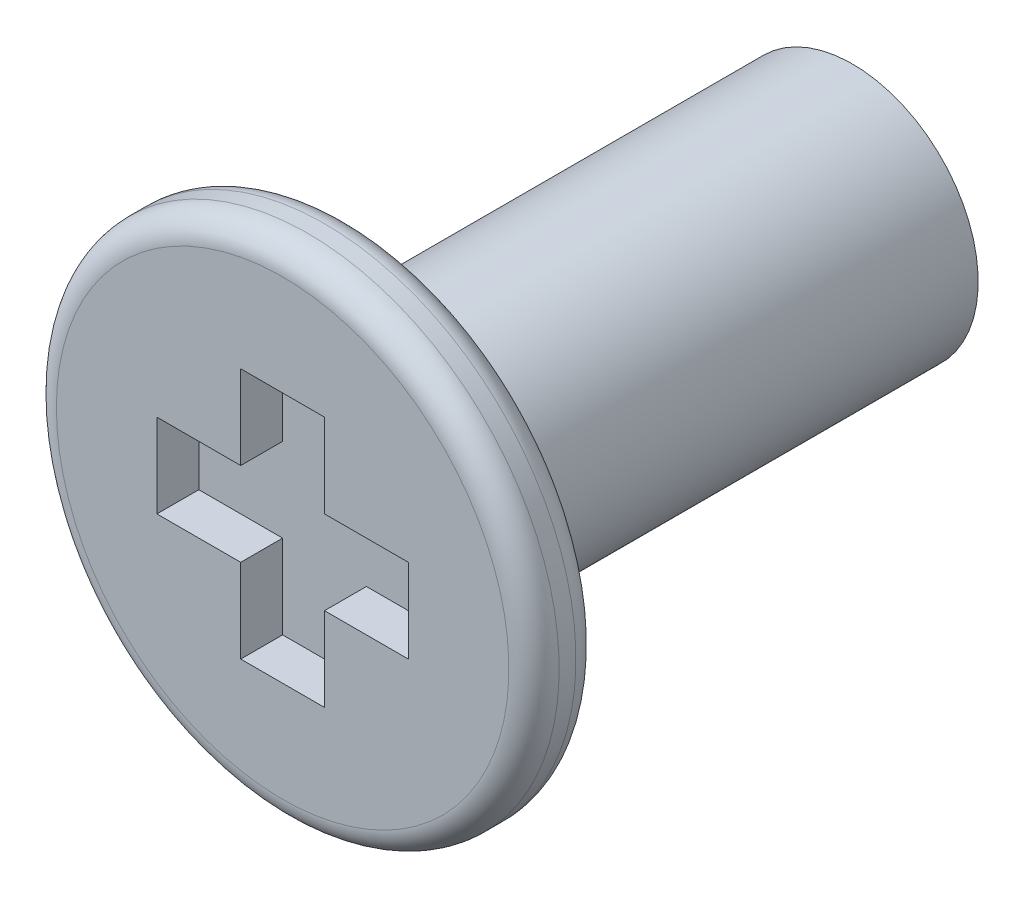
ISO-10303-21;
HEADER;
FILE_DESCRIPTION(('STEP AP214'),'2;1');
FILE_NAME('part.step','',(''),(''),'','','');
FILE_SCHEMA(('AUTOMOTIVE_DESIGN { 1 0 10303 214 1 1 1 1 }'));
ENDSEC;
DATA;
#1=APPLICATION_CONTEXT('core data for automotive mechanical design processes');
#2=APPLICATION_PROTOCOL_DEFINITION('international standard','automotive_design',2000,#1);
#3=PRODUCT_CONTEXT('',#1,'mechanical');
#4=PRODUCT('Part','Part','',(#3));
#5=PRODUCT_RELATED_PRODUCT_CATEGORY('part','',(#4));
#6=PRODUCT_DEFINITION_FORMATION('','',#4);
#7=PRODUCT_DEFINITION_CONTEXT('part definition',#1,'design');
#8=PRODUCT_DEFINITION('design','',#6,#7);
#9=PRODUCT_DEFINITION_SHAPE('','',#8);
#10=(LENGTH_UNIT() NAMED_UNIT(*) SI_UNIT(.MILLI.,.METRE.));
#11=(NAMED_UNIT(*) PLANE_ANGLE_UNIT() SI_UNIT($,.RADIAN.));
#12=(NAMED_UNIT(*) SI_UNIT($,.STERADIAN.) SOLID_ANGLE_UNIT());
#13=UNCERTAINTY_MEASURE_WITH_UNIT(LENGTH_MEASURE(1.E-05),#10,'distance_accuracy_value','');
#14=(GEOMETRIC_REPRESENTATION_CONTEXT(3) GLOBAL_UNCERTAINTY_ASSIGNED_CONTEXT((#13)) GLOBAL_UNIT_ASSIGNED_CONTEXT((#10,
#11,#12)) REPRESENTATION_CONTEXT('',''));
#15=CARTESIAN_POINT('',(0.,0.,0.));
#16=DIRECTION('',(0.,0.,1.));
#17=DIRECTION('',(1.,0.,0.));
#18=AXIS2_PLACEMENT_3D('',#15,#16,#17);
#19=CARTESIAN_POINT('',(0.,0.,0.3));
#20=DIRECTION('',(0.,0.,-1.));
#21=DIRECTION('',(0.,-1.,0.));
#22=AXIS2_PLACEMENT_3D('',#19,#20,#21);
#23=PLANE('',#22);
#24=DIRECTION('',(-1.,0.,0.));
#25=VECTOR('',#24,1.);
#26=CARTESIAN_POINT('',(0.499999988824129,-1.49999996647239,0.3));
#27=LINE('',#26,#25);
#28=CARTESIAN_POINT('',(0.499999988824129,-1.49999996647239,0.3));
#29=VERTEX_POINT('',#28);
#30=CARTESIAN_POINT('',(-0.499999988824129,-1.49999996647239,0.3));
#31=VERTEX_POINT('',#30);
#32=EDGE_CURVE('E11',#29,#31,#27,.T.);
#33=ORIENTED_EDGE('',*,*,#32,.F.);
#34=DIRECTION('',(0.,-1.,0.));
#35=VECTOR('',#34,1.);
#36=CARTESIAN_POINT('',(0.499999988824129,1.49999996647239,0.3));
#37=LINE('',#36,#35);
#38=CARTESIAN_POINT('',(0.499999988824129,-0.499999988824129,0.3));
#39=VERTEX_POINT('',#38);
#40=EDGE_CURVE('E271',#39,#29,#37,.T.);
#41=ORIENTED_EDGE('',*,*,#40,.F.);
#42=DIRECTION('',(-1.,0.,0.));
#43=VECTOR('',#42,1.);
#44=CARTESIAN_POINT('',(1.49999996647239,-0.499999988824129,0.3));
#45=LINE('',#44,#43);
#46=CARTESIAN_POINT('',(1.49999996647239,-0.499999988824129,0.3));
#47=VERTEX_POINT('',#46);
#48=EDGE_CURVE('E276',#47,#39,#45,.T.);
#49=ORIENTED_EDGE('',*,*,#48,.F.);
#50=DIRECTION('',(0.,-1.,0.));
#51=VECTOR('',#50,1.);
#52=CARTESIAN_POINT('',(1.49999996647239,0.499999988824129,0.3));
#53=LINE('',#52,#51);
#54=CARTESIAN_POINT('',(1.49999996647239,0.499999988824129,0.3));
#55=VERTEX_POINT('',#54);
#56=EDGE_CURVE('E222',#55,#47,#53,.T.);
#57=ORIENTED_EDGE('',*,*,#56,.F.);
#58=DIRECTION('',(1.,0.,0.));
#59=VECTOR('',#58,1.);
#60=CARTESIAN_POINT('',(-1.49999996647239,0.499999988824129,0.3));
#61=LINE('',#60,#59);
#62=CARTESIAN_POINT('',(0.499999988824129,0.499999988824129,0.3));
#63=VERTEX_POINT('',#62);
#64=EDGE_CURVE('E291',#63,#55,#61,.T.);
#65=ORIENTED_EDGE('',*,*,#64,.F.);
#66=DIRECTION('',(0.,-1.,0.));
#67=VECTOR('',#66,1.);
#68=CARTESIAN_POINT('',(0.499999988824129,1.49999996647239,0.3));
#69=LINE('',#68,#67);
#70=CARTESIAN_POINT('',(0.499999988824129,1.49999996647239,0.3));
#71=VERTEX_POINT('',#70);
#72=EDGE_CURVE('E298',#71,#63,#69,.T.);
#73=ORIENTED_EDGE('',*,*,#72,.F.);
#74=DIRECTION('',(1.,0.,0.));
#75=VECTOR('',#74,1.);
#76=CARTESIAN_POINT('',(-0.499999988824129,1.49999996647239,0.3));
#77=LINE('',#76,#75);
#78=CARTESIAN_POINT('',(-0.499999988824129,1.49999996647239,0.3));
#79=VERTEX_POINT('',#78);
#80=EDGE_CURVE('E217',#79,#71,#77,.T.);
#81=ORIENTED_EDGE('',*,*,#80,.F.);
#82=DIRECTION('',(0.,1.,0.));
#83=VECTOR('',#82,1.);
#84=CARTESIAN_POINT('',(-0.499999988824129,-1.49999996647239,0.3));
#85=LINE('',#84,#83);
#86=CARTESIAN_POINT('',(-0.499999988824129,0.499999988824129,0.3));
#87=VERTEX_POINT('',#86);
#88=EDGE_CURVE('E216',#87,#79,#85,.T.);
#89=ORIENTED_EDGE('',*,*,#88,.F.);
#90=DIRECTION('',(1.,0.,0.));
#91=VECTOR('',#90,1.);
#92=CARTESIAN_POINT('',(-1.49999996647239,0.499999988824129,0.3));
#93=LINE('',#92,#91);
#94=CARTESIAN_POINT('',(-1.49999996647239,0.499999988824129,0.3));
#95=VERTEX_POINT('',#94);
#96=EDGE_CURVE('E313',#95,#87,#93,.T.);
#97=ORIENTED_EDGE('',*,*,#96,.F.);
#98=DIRECTION('',(0.,1.,0.));
#99=VECTOR('',#98,1.);
#100=CARTESIAN_POINT('',(-1.49999996647239,-0.499999988824129,0.3));
#101=LINE('',#100,#99);
#102=CARTESIAN_POINT('',(-1.49999996647239,-0.499999988824129,0.3));
#103=VERTEX_POINT('',#102);
#104=EDGE_CURVE('E255',#103,#95,#101,.T.);
#105=ORIENTED_EDGE('',*,*,#104,.F.);
#106=DIRECTION('',(-1.,0.,0.));
#107=VECTOR('',#106,1.);
#108=CARTESIAN_POINT('',(1.49999996647239,-0.499999988824129,0.3));
#109=LINE('',#108,#107);
#110=CARTESIAN_POINT('',(-0.499999988824129,-0.499999988824129,0.3));
#111=VERTEX_POINT('',#110);
#112=EDGE_CURVE('E188',#111,#103,#109,.T.);
#113=ORIENTED_EDGE('',*,*,#112,.F.);
#114=DIRECTION('',(0.,1.,0.));
#115=VECTOR('',#114,1.);
#116=CARTESIAN_POINT('',(-0.499999988824129,-1.49999996647239,0.3));
#117=LINE('',#116,#115);
#118=EDGE_CURVE('E25',#31,#111,#117,.T.);
#119=ORIENTED_EDGE('',*,*,#118,.F.);
#120=EDGE_LOOP('',(#33,#41,#49,#57,#65,#73,#81,#89,#97,#105,#113,#119));
#121=FACE_BOUND('',#120,.T.);
#122=ADVANCED_FACE('F17',(#121),#23,.F.);
#123=CARTESIAN_POINT('',(0.499999988824129,-1.49999996647239,0.8));
#124=DIRECTION('',(0.,-1.,0.));
#125=DIRECTION('',(0.,0.,-1.));
#126=AXIS2_PLACEMENT_3D('',#123,#124,#125);
#127=PLANE('',#126);
#128=DIRECTION('',(-1.,0.,0.));
#129=VECTOR('',#128,1.);
#130=CARTESIAN_POINT('',(0.249999994412065,-1.49999996647239,0.8));
#131=LINE('',#130,#129);
#132=CARTESIAN_POINT('',(0.499999988824129,-1.49999996647239,0.8));
#133=VERTEX_POINT('',#132);
#134=CARTESIAN_POINT('',(-0.499999988824129,-1.49999996647239,0.8));
#135=VERTEX_POINT('',#134);
#136=EDGE_CURVE('E218',#133,#135,#131,.T.);
#137=ORIENTED_EDGE('',*,*,#136,.F.);
#138=DIRECTION('',(0.,0.,-1.));
#139=VECTOR('',#138,1.);
#140=CARTESIAN_POINT('',(0.499999988824129,-1.49999996647239,0.8));
#141=LINE('',#140,#139);
#142=EDGE_CURVE('E277',#133,#29,#141,.T.);
#143=ORIENTED_EDGE('',*,*,#142,.T.);
#144=ORIENTED_EDGE('',*,*,#32,.T.);
#145=DIRECTION('',(0.,0.,-1.));
#146=VECTOR('',#145,1.);
#147=CARTESIAN_POINT('',(-0.499999988824129,-1.49999996647239,0.8));
#148=LINE('',#147,#146);
#149=EDGE_CURVE('E191',#135,#31,#148,.T.);
#150=ORIENTED_EDGE('',*,*,#149,.F.);
#151=EDGE_LOOP('',(#137,#143,#144,#150));
#152=FACE_BOUND('',#151,.T.);
#153=ADVANCED_FACE('F345',(#152),#127,.F.);
#154=CARTESIAN_POINT('',(-0.499999988824129,-1.49999996647239,0.8));
#155=DIRECTION('',(-1.,0.,0.));
#156=DIRECTION('',(0.,0.,1.));
#157=AXIS2_PLACEMENT_3D('',#154,#155,#156);
#158=PLANE('',#157);
#159=DIRECTION('',(0.,1.,0.));
#160=VECTOR('',#159,1.);
#161=CARTESIAN_POINT('',(-0.499999988824129,-0.749999983236194,0.8));
#162=LINE('',#161,#160);
#163=CARTESIAN_POINT('',(-0.499999988824129,-0.499999988824129,0.8));
#164=VERTEX_POINT('',#163);
#165=EDGE_CURVE('E210',#135,#164,#162,.T.);
#166=ORIENTED_EDGE('',*,*,#165,.F.);
#167=ORIENTED_EDGE('',*,*,#149,.T.);
#168=ORIENTED_EDGE('',*,*,#118,.T.);
#169=DIRECTION('',(0.,0.,-1.));
#170=VECTOR('',#169,1.);
#171=CARTESIAN_POINT('',(-0.499999988824129,-0.499999988824129,0.8));
#172=LINE('',#171,#170);
#173=EDGE_CURVE('E192',#164,#111,#172,.T.);
#174=ORIENTED_EDGE('',*,*,#173,.F.);
#175=EDGE_LOOP('',(#166,#167,#168,#174));
#176=FACE_BOUND('',#175,.T.);
#177=ADVANCED_FACE('F343',(#176),#158,.F.);
#178=CARTESIAN_POINT('',(-0.499999988824129,-0.499999988824129,0.8));
#179=DIRECTION('',(0.,-1.,0.));
#180=DIRECTION('',(0.,0.,-1.));
#181=AXIS2_PLACEMENT_3D('',#178,#179,#180);
#182=PLANE('',#181);
#183=DIRECTION('',(-1.,0.,0.));
#184=VECTOR('',#183,1.);
#185=CARTESIAN_POINT('',(-0.249999994412065,-0.499999988824129,0.8));
#186=LINE('',#185,#184);
#187=CARTESIAN_POINT('',(-1.49999996647239,-0.499999988824129,0.8));
#188=VERTEX_POINT('',#187);
#189=EDGE_CURVE('E206',#164,#188,#186,.T.);
#190=ORIENTED_EDGE('',*,*,#189,.F.);
#191=ORIENTED_EDGE('',*,*,#173,.T.);
#192=ORIENTED_EDGE('',*,*,#112,.T.);
#193=DIRECTION('',(0.,0.,-1.));
#194=VECTOR('',#193,1.);
#195=CARTESIAN_POINT('',(-1.49999996647239,-0.499999988824129,0.8));
#196=LINE('',#195,#194);
#197=EDGE_CURVE('E316',#188,#103,#196,.T.);
#198=ORIENTED_EDGE('',*,*,#197,.F.);
#199=EDGE_LOOP('',(#190,#191,#192,#198));
#200=FACE_BOUND('',#199,.T.);
#201=ADVANCED_FACE('F341',(#200),#182,.F.);
#202=CARTESIAN_POINT('',(-1.49999996647239,-0.499999988824129,0.8));
#203=DIRECTION('',(-1.,0.,0.));
#204=DIRECTION('',(0.,0.,1.));
#205=AXIS2_PLACEMENT_3D('',#202,#203,#204);
#206=PLANE('',#205);
#207=DIRECTION('',(0.,1.,0.));
#208=VECTOR('',#207,1.);
#209=CARTESIAN_POINT('',(-1.49999996647239,-0.249999994412065,0.8));
#210=LINE('',#209,#208);
#211=CARTESIAN_POINT('',(-1.49999996647239,0.499999988824129,0.8));
#212=VERTEX_POINT('',#211);
#213=EDGE_CURVE('E209',#188,#212,#210,.T.);
#214=ORIENTED_EDGE('',*,*,#213,.F.);
#215=ORIENTED_EDGE('',*,*,#197,.T.);
#216=ORIENTED_EDGE('',*,*,#104,.T.);
#217=DIRECTION('',(0.,0.,-1.));
#218=VECTOR('',#217,1.);
#219=CARTESIAN_POINT('',(-1.49999996647239,0.499999988824129,0.8));
#220=LINE('',#219,#218);
#221=EDGE_CURVE('E309',#212,#95,#220,.T.);
#222=ORIENTED_EDGE('',*,*,#221,.F.);
#223=EDGE_LOOP('',(#214,#215,#216,#222));
#224=FACE_BOUND('',#223,.T.);
#225=ADVANCED_FACE('F326',(#224),#206,.F.);
#226=CARTESIAN_POINT('',(-1.49999996647239,0.499999988824129,0.8));
#227=DIRECTION('',(0.,1.,0.));
#228=DIRECTION('',(1.,0.,0.));
#229=AXIS2_PLACEMENT_3D('',#226,#227,#228);
#230=PLANE('',#229);
#231=DIRECTION('',(1.,0.,0.));
#232=VECTOR('',#231,1.);
#233=CARTESIAN_POINT('',(-0.749999983236194,0.499999988824129,0.8));
#234=LINE('',#233,#232);
#235=CARTESIAN_POINT('',(-0.499999988824129,0.499999988824129,0.8));
#236=VERTEX_POINT('',#235);
#237=EDGE_CURVE('E233',#212,#236,#234,.T.);
#238=ORIENTED_EDGE('',*,*,#237,.F.);
#239=ORIENTED_EDGE('',*,*,#221,.T.);
#240=ORIENTED_EDGE('',*,*,#96,.T.);
#241=DIRECTION('',(0.,0.,-1.));
#242=VECTOR('',#241,1.);
#243=CARTESIAN_POINT('',(-0.499999988824129,0.499999988824129,0.8));
#244=LINE('',#243,#242);
#245=EDGE_CURVE('E212',#236,#87,#244,.T.);
#246=ORIENTED_EDGE('',*,*,#245,.F.);
#247=EDGE_LOOP('',(#238,#239,#240,#246));
#248=FACE_BOUND('',#247,.T.);
#249=ADVANCED_FACE('F332',(#248),#230,.F.);
#250=CARTESIAN_POINT('',(-0.499999988824129,0.499999988824129,0.8));
#251=DIRECTION('',(-1.,0.,0.));
#252=DIRECTION('',(0.,0.,1.));
#253=AXIS2_PLACEMENT_3D('',#250,#251,#252);
#254=PLANE('',#253);
#255=DIRECTION('',(0.,1.,0.));
#256=VECTOR('',#255,1.);
#257=CARTESIAN_POINT('',(-0.499999988824129,0.249999994412065,0.8));
#258=LINE('',#257,#256);
#259=CARTESIAN_POINT('',(-0.499999988824129,1.49999996647239,0.8));
#260=VERTEX_POINT('',#259);
#261=EDGE_CURVE('E237',#236,#260,#258,.T.);
#262=ORIENTED_EDGE('',*,*,#261,.F.);
#263=ORIENTED_EDGE('',*,*,#245,.T.);
#264=ORIENTED_EDGE('',*,*,#88,.T.);
#265=DIRECTION('',(0.,0.,-1.));
#266=VECTOR('',#265,1.);
#267=CARTESIAN_POINT('',(-0.499999988824129,1.49999996647239,0.8));
#268=LINE('',#267,#266);
#269=EDGE_CURVE('E301',#260,#79,#268,.T.);
#270=ORIENTED_EDGE('',*,*,#269,.F.);
#271=EDGE_LOOP('',(#262,#263,#264,#270));
#272=FACE_BOUND('',#271,.T.);
#273=ADVANCED_FACE('F399',(#272),#254,.F.);
#274=CARTESIAN_POINT('',(-0.499999988824129,1.49999996647239,0.8));
#275=DIRECTION('',(0.,1.,0.));
#276=DIRECTION('',(1.,0.,0.));
#277=AXIS2_PLACEMENT_3D('',#274,#275,#276);
#278=PLANE('',#277);
#279=DIRECTION('',(1.,0.,0.));
#280=VECTOR('',#279,1.);
#281=CARTESIAN_POINT('',(-0.249999994412065,1.49999996647239,0.8));
#282=LINE('',#281,#280);
#283=CARTESIAN_POINT('',(0.499999988824129,1.49999996647239,0.8));
#284=VERTEX_POINT('',#283);
#285=EDGE_CURVE('E241',#260,#284,#282,.T.);
#286=ORIENTED_EDGE('',*,*,#285,.F.);
#287=ORIENTED_EDGE('',*,*,#269,.T.);
#288=ORIENTED_EDGE('',*,*,#80,.T.);
#289=DIRECTION('',(0.,0.,-1.));
#290=VECTOR('',#289,1.);
#291=CARTESIAN_POINT('',(0.499999988824129,1.49999996647239,0.8));
#292=LINE('',#291,#290);
#293=EDGE_CURVE('E294',#284,#71,#292,.T.);
#294=ORIENTED_EDGE('',*,*,#293,.F.);
#295=EDGE_LOOP('',(#286,#287,#288,#294));
#296=FACE_BOUND('',#295,.T.);
#297=ADVANCED_FACE('F402',(#296),#278,.F.);
#298=CARTESIAN_POINT('',(0.499999988824129,1.49999996647239,0.8));
#299=DIRECTION('',(1.,0.,0.));
#300=DIRECTION('',(0.,1.,0.));
#301=AXIS2_PLACEMENT_3D('',#298,#299,#300);
#302=PLANE('',#301);
#303=DIRECTION('',(0.,-1.,0.));
#304=VECTOR('',#303,1.);
#305=CARTESIAN_POINT('',(0.499999988824129,0.749999983236194,0.8));
#306=LINE('',#305,#304);
#307=CARTESIAN_POINT('',(0.499999988824129,0.499999988824129,0.8));
#308=VERTEX_POINT('',#307);
#309=EDGE_CURVE('E245',#284,#308,#306,.T.);
#310=ORIENTED_EDGE('',*,*,#309,.F.);
#311=ORIENTED_EDGE('',*,*,#293,.T.);
#312=ORIENTED_EDGE('',*,*,#72,.T.);
#313=DIRECTION('',(0.,0.,-1.));
#314=VECTOR('',#313,1.);
#315=CARTESIAN_POINT('',(0.499999988824129,0.499999988824129,0.8));
#316=LINE('',#315,#314);
#317=EDGE_CURVE('E225',#308,#63,#316,.T.);
#318=ORIENTED_EDGE('',*,*,#317,.F.);
#319=EDGE_LOOP('',(#310,#311,#312,#318));
#320=FACE_BOUND('',#319,.T.);
#321=ADVANCED_FACE('F408',(#320),#302,.F.);
#322=CARTESIAN_POINT('',(0.499999988824129,0.499999988824129,0.8));
#323=DIRECTION('',(0.,1.,0.));
#324=DIRECTION('',(1.,0.,0.));
#325=AXIS2_PLACEMENT_3D('',#322,#323,#324);
#326=PLANE('',#325);
#327=DIRECTION('',(1.,0.,0.));
#328=VECTOR('',#327,1.);
#329=CARTESIAN_POINT('',(0.249999994412065,0.499999988824129,0.8));
#330=LINE('',#329,#328);
#331=CARTESIAN_POINT('',(1.49999996647239,0.499999988824129,0.8));
#332=VERTEX_POINT('',#331);
#333=EDGE_CURVE('E251',#308,#332,#330,.T.);
#334=ORIENTED_EDGE('',*,*,#333,.F.);
#335=ORIENTED_EDGE('',*,*,#317,.T.);
#336=ORIENTED_EDGE('',*,*,#64,.T.);
#337=DIRECTION('',(0.,0.,-1.));
#338=VECTOR('',#337,1.);
#339=CARTESIAN_POINT('',(1.49999996647239,0.499999988824129,0.8));
#340=LINE('',#339,#338);
#341=EDGE_CURVE('E226',#332,#55,#340,.T.);
#342=ORIENTED_EDGE('',*,*,#341,.F.);
#343=EDGE_LOOP('',(#334,#335,#336,#342));
#344=FACE_BOUND('',#343,.T.);
#345=ADVANCED_FACE('F410',(#344),#326,.F.);
#346=CARTESIAN_POINT('',(1.49999996647239,0.499999988824129,0.8));
#347=DIRECTION('',(1.,0.,0.));
#348=DIRECTION('',(0.,1.,0.));
#349=AXIS2_PLACEMENT_3D('',#346,#347,#348);
#350=PLANE('',#349);
#351=DIRECTION('',(0.,-1.,0.));
#352=VECTOR('',#351,1.);
#353=CARTESIAN_POINT('',(1.49999996647239,0.249999994412065,0.8));
#354=LINE('',#353,#352);
#355=CARTESIAN_POINT('',(1.49999996647239,-0.499999988824129,0.8));
#356=VERTEX_POINT('',#355);
#357=EDGE_CURVE('E259',#332,#356,#354,.T.);
#358=ORIENTED_EDGE('',*,*,#357,.F.);
#359=ORIENTED_EDGE('',*,*,#341,.T.);
#360=ORIENTED_EDGE('',*,*,#56,.T.);
#361=DIRECTION('',(0.,0.,-1.));
#362=VECTOR('',#361,1.);
#363=CARTESIAN_POINT('',(1.49999996647239,-0.499999988824129,0.8));
#364=LINE('',#363,#362);
#365=EDGE_CURVE('E272',#356,#47,#364,.T.);
#366=ORIENTED_EDGE('',*,*,#365,.F.);
#367=EDGE_LOOP('',(#358,#359,#360,#366));
#368=FACE_BOUND('',#367,.T.);
#369=ADVANCED_FACE('F413',(#368),#350,.F.);
#370=CARTESIAN_POINT('',(1.49999996647239,-0.499999988824129,0.8));
#371=DIRECTION('',(0.,-1.,0.));
#372=DIRECTION('',(0.,0.,-1.));
#373=AXIS2_PLACEMENT_3D('',#370,#371,#372);
#374=PLANE('',#373);
#375=DIRECTION('',(-1.,0.,0.));
#376=VECTOR('',#375,1.);
#377=CARTESIAN_POINT('',(0.749999983236194,-0.499999988824129,0.8));
#378=LINE('',#377,#376);
#379=CARTESIAN_POINT('',(0.499999988824129,-0.499999988824129,0.8));
#380=VERTEX_POINT('',#379);
#381=EDGE_CURVE('E263',#356,#380,#378,.T.);
#382=ORIENTED_EDGE('',*,*,#381,.F.);
#383=ORIENTED_EDGE('',*,*,#365,.T.);
#384=ORIENTED_EDGE('',*,*,#48,.T.);
#385=DIRECTION('',(0.,0.,-1.));
#386=VECTOR('',#385,1.);
#387=CARTESIAN_POINT('',(0.499999988824129,-0.499999988824129,0.8));
#388=LINE('',#387,#386);
#389=EDGE_CURVE('E267',#380,#39,#388,.T.);
#390=ORIENTED_EDGE('',*,*,#389,.F.);
#391=EDGE_LOOP('',(#382,#383,#384,#390));
#392=FACE_BOUND('',#391,.T.);
#393=ADVANCED_FACE('F419',(#392),#374,.F.);
#394=CARTESIAN_POINT('',(0.499999988824129,-0.499999988824129,0.8));
#395=DIRECTION('',(1.,0.,0.));
#396=DIRECTION('',(0.,1.,0.));
#397=AXIS2_PLACEMENT_3D('',#394,#395,#396);
#398=PLANE('',#397);
#399=DIRECTION('',(0.,-1.,0.));
#400=VECTOR('',#399,1.);
#401=CARTESIAN_POINT('',(0.499999988824129,-0.249999994412065,0.8));
#402=LINE('',#401,#400);
#403=EDGE_CURVE('E165',#380,#133,#402,.T.);
#404=ORIENTED_EDGE('',*,*,#403,.F.);
#405=ORIENTED_EDGE('',*,*,#389,.T.);
#406=ORIENTED_EDGE('',*,*,#40,.T.);
#407=ORIENTED_EDGE('',*,*,#142,.F.);
#408=EDGE_LOOP('',(#404,#405,#406,#407));
#409=FACE_BOUND('',#408,.T.);
#410=ADVANCED_FACE('F423',(#409),#398,.F.);
#411=CARTESIAN_POINT('',(0.,0.,0.8));
#412=DIRECTION('',(0.,0.,1.));
#413=DIRECTION('',(1.,0.,0.));
#414=AXIS2_PLACEMENT_3D('',#411,#412,#413);
#415=PLANE('',#414);
#416=ORIENTED_EDGE('',*,*,#403,.T.);
#417=ORIENTED_EDGE('',*,*,#136,.T.);
#418=ORIENTED_EDGE('',*,*,#165,.T.);
#419=ORIENTED_EDGE('',*,*,#189,.T.);
#420=ORIENTED_EDGE('',*,*,#213,.T.);
#421=ORIENTED_EDGE('',*,*,#237,.T.);
#422=ORIENTED_EDGE('',*,*,#261,.T.);
#423=ORIENTED_EDGE('',*,*,#285,.T.);
#424=ORIENTED_EDGE('',*,*,#309,.T.);
#425=ORIENTED_EDGE('',*,*,#333,.T.);
#426=ORIENTED_EDGE('',*,*,#357,.T.);
#427=ORIENTED_EDGE('',*,*,#381,.T.);
#428=EDGE_LOOP('',(#416,#417,#418,#419,#420,#421,#422,#423,#424,#425,#426,#427));
#429=FACE_BOUND('',#428,.T.);
#430=CARTESIAN_POINT('',(0.,0.,0.8));
#431=DIRECTION('',(0.,0.,-1.));
#432=DIRECTION('',(1.,0.,0.));
#433=AXIS2_PLACEMENT_3D('',#430,#431,#432);
#434=CIRCLE('',#433,2.7);
#435=CARTESIAN_POINT('',(-2.7,0.,0.8));
#436=VERTEX_POINT('',#435);
#437=EDGE_CURVE('E163',#436,#436,#434,.T.);
#438=ORIENTED_EDGE('',*,*,#437,.F.);
#439=EDGE_LOOP('',(#438));
#440=FACE_BOUND('',#439,.T.);
#441=ADVANCED_FACE('F336',(#429,#440),#415,.T.);
#442=CARTESIAN_POINT('',(0.,0.,0.5));
#443=DIRECTION('',(0.,0.,1.));
#444=DIRECTION('',(1.,0.,0.));
#445=AXIS2_PLACEMENT_3D('',#442,#443,#444);
#446=TOROIDAL_SURFACE('',#445,2.7,0.3);
#447=ORIENTED_EDGE('',*,*,#437,.T.);
#448=CARTESIAN_POINT('',(-2.7,0.,0.5));
#449=DIRECTION('',(0.,-1.,0.));
#450=DIRECTION('',(-1.,0.,0.));
#451=AXIS2_PLACEMENT_3D('',#448,#449,#450);
#452=CIRCLE('',#451,0.3);
#453=CARTESIAN_POINT('',(-3.,0.,0.5));
#454=VERTEX_POINT('',#453);
#455=EDGE_CURVE('E157',#436,#454,#452,.T.);
#456=ORIENTED_EDGE('',*,*,#455,.T.);
#457=CARTESIAN_POINT('',(0.,0.,0.5));
#458=DIRECTION('',(0.,0.,1.));
#459=DIRECTION('',(1.,0.,0.));
#460=AXIS2_PLACEMENT_3D('',#457,#458,#459);
#461=CIRCLE('',#460,3.);
#462=EDGE_CURVE('E161',#454,#454,#461,.T.);
#463=ORIENTED_EDGE('',*,*,#462,.T.);
#464=ORIENTED_EDGE('',*,*,#455,.F.);
#465=EDGE_LOOP('',(#447,#456,#463,#464));
#466=FACE_BOUND('',#465,.T.);
#467=ADVANCED_FACE('F159',(#466),#446,.T.);
#468=CARTESIAN_POINT('',(0.,0.,0.));
#469=DIRECTION('',(0.,0.,1.));
#470=DIRECTION('',(1.,0.,0.));
#471=AXIS2_PLACEMENT_3D('',#468,#469,#470);
#472=PLANE('',#471);
#473=CARTESIAN_POINT('',(0.,0.,0.));
#474=DIRECTION('',(0.,0.,1.));
#475=DIRECTION('',(1.,0.,0.));
#476=AXIS2_PLACEMENT_3D('',#473,#474,#475);
#477=CIRCLE('',#476,1.5);
#478=CARTESIAN_POINT('',(-1.5,0.,0.));
#479=VERTEX_POINT('',#478);
#480=EDGE_CURVE('E193',#479,#479,#477,.T.);
#481=ORIENTED_EDGE('',*,*,#480,.T.);
#482=EDGE_LOOP('',(#481));
#483=FACE_BOUND('',#482,.T.);
#484=CARTESIAN_POINT('',(0.,0.,0.));
#485=DIRECTION('',(0.,0.,1.));
#486=DIRECTION('',(1.,0.,0.));
#487=AXIS2_PLACEMENT_3D('',#484,#485,#486);
#488=CIRCLE('',#487,2.7);
#489=CARTESIAN_POINT('',(-2.7,0.,0.));
#490=VERTEX_POINT('',#489);
#491=EDGE_CURVE('E182',#490,#490,#488,.T.);
#492=ORIENTED_EDGE('',*,*,#491,.F.);
#493=EDGE_LOOP('',(#492));
#494=FACE_BOUND('',#493,.T.);
#495=ADVANCED_FACE('F368',(#483,#494),#472,.F.);
#496=CARTESIAN_POINT('',(0.,0.,0.));
#497=DIRECTION('',(0.,0.,1.));
#498=DIRECTION('',(1.,0.,0.));
#499=AXIS2_PLACEMENT_3D('',#496,#497,#498);
#500=CYLINDRICAL_SURFACE('',#499,3.);
#501=ORIENTED_EDGE('',*,*,#462,.F.);
#502=DIRECTION('',(0.,0.,-1.));
#503=VECTOR('',#502,1.);
#504=CARTESIAN_POINT('',(-3.,0.,0.));
#505=LINE('',#504,#503);
#506=CARTESIAN_POINT('',(-3.,0.,0.3));
#507=VERTEX_POINT('',#506);
#508=EDGE_CURVE('E169',#454,#507,#505,.T.);
#509=ORIENTED_EDGE('',*,*,#508,.T.);
#510=CARTESIAN_POINT('',(0.,0.,0.3));
#511=DIRECTION('',(0.,0.,-1.));
#512=DIRECTION('',(1.,0.,0.));
#513=AXIS2_PLACEMENT_3D('',#510,#511,#512);
#514=CIRCLE('',#513,3.);
#515=EDGE_CURVE('E172',#507,#507,#514,.T.);
#516=ORIENTED_EDGE('',*,*,#515,.F.);
#517=ORIENTED_EDGE('',*,*,#508,.F.);
#518=EDGE_LOOP('',(#501,#509,#516,#517));
#519=FACE_BOUND('',#518,.T.);
#520=ADVANCED_FACE('F170',(#519),#500,.T.);
#521=CARTESIAN_POINT('',(0.,0.,0.3));
#522=DIRECTION('',(0.,0.,1.));
#523=DIRECTION('',(1.,0.,0.));
#524=AXIS2_PLACEMENT_3D('',#521,#522,#523);
#525=TOROIDAL_SURFACE('',#524,2.7,0.3);
#526=ORIENTED_EDGE('',*,*,#515,.T.);
#527=CARTESIAN_POINT('',(-2.7,0.,0.3));
#528=DIRECTION('',(0.,-1.,0.));
#529=DIRECTION('',(-1.,0.,0.));
#530=AXIS2_PLACEMENT_3D('',#527,#528,#529);
#531=CIRCLE('',#530,0.3);
#532=EDGE_CURVE('E198',#507,#490,#531,.T.);
#533=ORIENTED_EDGE('',*,*,#532,.T.);
#534=ORIENTED_EDGE('',*,*,#491,.T.);
#535=ORIENTED_EDGE('',*,*,#532,.F.);
#536=EDGE_LOOP('',(#526,#533,#534,#535));
#537=FACE_BOUND('',#536,.T.);
#538=ADVANCED_FACE('F374',(#537),#525,.T.);
#539=CARTESIAN_POINT('',(0.,0.,-6.));
#540=DIRECTION('',(0.,0.,-1.));
#541=DIRECTION('',(0.,-1.,0.));
#542=AXIS2_PLACEMENT_3D('',#539,#540,#541);
#543=PLANE('',#542);
#544=CARTESIAN_POINT('',(0.,0.,-6.));
#545=DIRECTION('',(0.,0.,-1.));
#546=DIRECTION('',(1.,0.,0.));
#547=AXIS2_PLACEMENT_3D('',#544,#545,#546);
#548=CIRCLE('',#547,1.5);
#549=CARTESIAN_POINT('',(-1.5,0.,-6.));
#550=VERTEX_POINT('',#549);
#551=EDGE_CURVE('E353',#550,#550,#548,.T.);
#552=ORIENTED_EDGE('',*,*,#551,.T.);
#553=EDGE_LOOP('',(#552));
#554=FACE_BOUND('',#553,.T.);
#555=ADVANCED_FACE('F376',(#554),#543,.T.);
#556=CARTESIAN_POINT('',(0.,0.,0.));
#557=DIRECTION('',(0.,0.,-1.));
#558=DIRECTION('',(1.,0.,0.));
#559=AXIS2_PLACEMENT_3D('',#556,#557,#558);
#560=CYLINDRICAL_SURFACE('',#559,1.5);
#561=ORIENTED_EDGE('',*,*,#551,.F.);
#562=DIRECTION('',(0.,0.,1.));
#563=VECTOR('',#562,1.);
#564=CARTESIAN_POINT('',(-1.5,0.,0.));
#565=LINE('',#564,#563);
#566=EDGE_CURVE('E185',#550,#479,#565,.T.);
#567=ORIENTED_EDGE('',*,*,#566,.T.);
#568=ORIENTED_EDGE('',*,*,#480,.F.);
#569=ORIENTED_EDGE('',*,*,#566,.F.);
#570=EDGE_LOOP('',(#561,#567,#568,#569));
#571=FACE_BOUND('',#570,.T.);
#572=ADVANCED_FACE('F366',(#571),#560,.T.);
#573=CLOSED_SHELL('',(#122,#153,#177,#201,#225,#249,#273,#297,#321,#345,#369,#393,#410,#441,
#467,#495,#520,#538,#555,#572));
#574=MANIFOLD_SOLID_BREP('B1',#573);
#575=ADVANCED_BREP_SHAPE_REPRESENTATION('',(#18,#574),#14);
#576=SHAPE_DEFINITION_REPRESENTATION(#9,#575);
ENDSEC;
END-ISO-10303-21;
